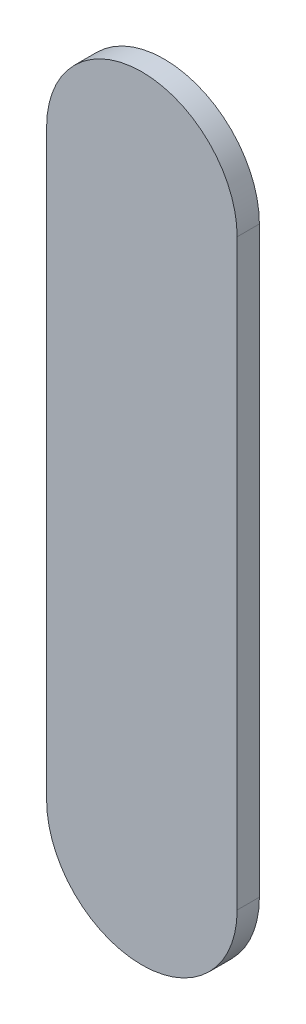
ISO-10303-21;
HEADER;
FILE_DESCRIPTION(('STEP AP214'),'2;1');
FILE_NAME('part.step','',(''),(''),'','','');
FILE_SCHEMA(('AUTOMOTIVE_DESIGN { 1 0 10303 214 1 1 1 1 }'));
ENDSEC;
DATA;
#1=APPLICATION_CONTEXT('core data for automotive mechanical design processes');
#2=APPLICATION_PROTOCOL_DEFINITION('international standard','automotive_design',2000,#1);
#3=PRODUCT_CONTEXT('',#1,'mechanical');
#4=PRODUCT('Part','Part','',(#3));
#5=PRODUCT_RELATED_PRODUCT_CATEGORY('part','',(#4));
#6=PRODUCT_DEFINITION_FORMATION('','',#4);
#7=PRODUCT_DEFINITION_CONTEXT('part definition',#1,'design');
#8=PRODUCT_DEFINITION('design','',#6,#7);
#9=PRODUCT_DEFINITION_SHAPE('','',#8);
#10=(LENGTH_UNIT() NAMED_UNIT(*) SI_UNIT(.MILLI.,.METRE.));
#11=(NAMED_UNIT(*) PLANE_ANGLE_UNIT() SI_UNIT($,.RADIAN.));
#12=(NAMED_UNIT(*) SI_UNIT($,.STERADIAN.) SOLID_ANGLE_UNIT());
#13=UNCERTAINTY_MEASURE_WITH_UNIT(LENGTH_MEASURE(1.E-05),#10,'distance_accuracy_value','');
#14=(GEOMETRIC_REPRESENTATION_CONTEXT(3) GLOBAL_UNCERTAINTY_ASSIGNED_CONTEXT((#13)) GLOBAL_UNIT_ASSIGNED_CONTEXT((#10,
#11,#12)) REPRESENTATION_CONTEXT('',''));
#15=CARTESIAN_POINT('',(0.,0.,0.));
#16=DIRECTION('',(0.,0.,1.));
#17=DIRECTION('',(1.,0.,0.));
#18=AXIS2_PLACEMENT_3D('',#15,#16,#17);
#19=CARTESIAN_POINT('',(150.95,-114.513,1.635));
#20=DIRECTION('',(0.,0.,1.));
#21=DIRECTION('',(1.,0.,0.));
#22=AXIS2_PLACEMENT_3D('',#19,#20,#21);
#23=PLANE('',#22);
#24=DIRECTION('',(0.,1.,0.));
#25=VECTOR('',#24,1.);
#26=CARTESIAN_POINT('',(150.95,-114.513,1.635));
#27=LINE('',#26,#25);
#28=CARTESIAN_POINT('',(150.95,-114.513,1.635));
#29=VERTEX_POINT('',#28);
#30=CARTESIAN_POINT('',(150.95,-113.595,1.635));
#31=VERTEX_POINT('',#30);
#32=EDGE_CURVE('E82',#29,#31,#27,.T.);
#33=ORIENTED_EDGE('',*,*,#32,.T.);
#34=CARTESIAN_POINT('',(150.8,-113.595,1.635));
#35=DIRECTION('',(0.,0.,1.));
#36=DIRECTION('',(1.,-1.894780628694E-13,0.));
#37=AXIS2_PLACEMENT_3D('',#34,#35,#36);
#38=CIRCLE('',#37,0.15);
#39=CARTESIAN_POINT('',(150.65,-113.595,1.635));
#40=VERTEX_POINT('',#39);
#41=EDGE_CURVE('E105',#31,#40,#38,.T.);
#42=ORIENTED_EDGE('',*,*,#41,.T.);
#43=DIRECTION('',(0.,-1.,0.));
#44=VECTOR('',#43,1.);
#45=CARTESIAN_POINT('',(150.65,-113.595,1.635));
#46=LINE('',#45,#44);
#47=CARTESIAN_POINT('',(150.65,-114.513,1.635));
#48=VERTEX_POINT('',#47);
#49=EDGE_CURVE('E75',#40,#48,#46,.T.);
#50=ORIENTED_EDGE('',*,*,#49,.T.);
#51=CARTESIAN_POINT('',(150.8,-114.513,1.635));
#52=DIRECTION('',(0.,0.,1.));
#53=DIRECTION('',(-1.,0.,0.));
#54=AXIS2_PLACEMENT_3D('',#51,#52,#53);
#55=CIRCLE('',#54,0.15);
#56=EDGE_CURVE('E11',#48,#29,#55,.T.);
#57=ORIENTED_EDGE('',*,*,#56,.T.);
#58=EDGE_LOOP('',(#33,#42,#50,#57));
#59=FACE_BOUND('',#58,.T.);
#60=ADVANCED_FACE('F17',(#59),#23,.T.);
#61=CARTESIAN_POINT('',(150.95,-114.513,1.6));
#62=DIRECTION('',(0.,0.,1.));
#63=DIRECTION('',(1.,0.,0.));
#64=AXIS2_PLACEMENT_3D('',#61,#62,#63);
#65=PLANE('',#64);
#66=CARTESIAN_POINT('',(150.8,-114.513,1.6));
#67=DIRECTION('',(0.,0.,1.));
#68=DIRECTION('',(-1.,0.,0.));
#69=AXIS2_PLACEMENT_3D('',#66,#67,#68);
#70=CIRCLE('',#69,0.15);
#71=CARTESIAN_POINT('',(150.65,-114.513,1.6));
#72=VERTEX_POINT('',#71);
#73=CARTESIAN_POINT('',(150.95,-114.513,1.6));
#74=VERTEX_POINT('',#73);
#75=EDGE_CURVE('E21',#72,#74,#70,.T.);
#76=ORIENTED_EDGE('',*,*,#75,.F.);
#77=DIRECTION('',(0.,-1.,0.));
#78=VECTOR('',#77,1.);
#79=CARTESIAN_POINT('',(150.65,-113.595,1.6));
#80=LINE('',#79,#78);
#81=CARTESIAN_POINT('',(150.65,-113.595,1.6));
#82=VERTEX_POINT('',#81);
#83=EDGE_CURVE('E109',#82,#72,#80,.T.);
#84=ORIENTED_EDGE('',*,*,#83,.F.);
#85=CARTESIAN_POINT('',(150.8,-113.595,1.6));
#86=DIRECTION('',(0.,0.,1.));
#87=DIRECTION('',(1.,-1.894780628694E-13,0.));
#88=AXIS2_PLACEMENT_3D('',#85,#86,#87);
#89=CIRCLE('',#88,0.15);
#90=CARTESIAN_POINT('',(150.95,-113.595,1.6));
#91=VERTEX_POINT('',#90);
#92=EDGE_CURVE('E84',#91,#82,#89,.T.);
#93=ORIENTED_EDGE('',*,*,#92,.F.);
#94=DIRECTION('',(0.,1.,0.));
#95=VECTOR('',#94,1.);
#96=CARTESIAN_POINT('',(150.95,-114.513,1.6));
#97=LINE('',#96,#95);
#98=EDGE_CURVE('E80',#74,#91,#97,.T.);
#99=ORIENTED_EDGE('',*,*,#98,.F.);
#100=EDGE_LOOP('',(#76,#84,#93,#99));
#101=FACE_BOUND('',#100,.T.);
#102=ADVANCED_FACE('F86',(#101),#65,.F.);
#103=CARTESIAN_POINT('',(150.8,-114.513,1.6));
#104=DIRECTION('',(0.,0.,-1.));
#105=DIRECTION('',(-1.,0.,0.));
#106=AXIS2_PLACEMENT_3D('',#103,#104,#105);
#107=CYLINDRICAL_SURFACE('',#106,0.15);
#108=ORIENTED_EDGE('',*,*,#75,.T.);
#109=DIRECTION('',(0.,0.,1.));
#110=VECTOR('',#109,1.);
#111=CARTESIAN_POINT('',(150.95,-114.513,1.6));
#112=LINE('',#111,#110);
#113=EDGE_CURVE('E69',#74,#29,#112,.T.);
#114=ORIENTED_EDGE('',*,*,#113,.T.);
#115=ORIENTED_EDGE('',*,*,#56,.F.);
#116=DIRECTION('',(0.,0.,1.));
#117=VECTOR('',#116,1.);
#118=CARTESIAN_POINT('',(150.65,-114.513,1.6));
#119=LINE('',#118,#117);
#120=EDGE_CURVE('E72',#72,#48,#119,.T.);
#121=ORIENTED_EDGE('',*,*,#120,.F.);
#122=EDGE_LOOP('',(#108,#114,#115,#121));
#123=FACE_BOUND('',#122,.T.);
#124=ADVANCED_FACE('F19',(#123),#107,.T.);
#125=CARTESIAN_POINT('',(150.65,-113.595,1.6));
#126=DIRECTION('',(1.,0.,0.));
#127=DIRECTION('',(0.,1.,0.));
#128=AXIS2_PLACEMENT_3D('',#125,#126,#127);
#129=PLANE('',#128);
#130=ORIENTED_EDGE('',*,*,#83,.T.);
#131=ORIENTED_EDGE('',*,*,#120,.T.);
#132=ORIENTED_EDGE('',*,*,#49,.F.);
#133=DIRECTION('',(0.,0.,1.));
#134=VECTOR('',#133,1.);
#135=CARTESIAN_POINT('',(150.65,-113.595,1.6));
#136=LINE('',#135,#134);
#137=EDGE_CURVE('E101',#82,#40,#136,.T.);
#138=ORIENTED_EDGE('',*,*,#137,.F.);
#139=EDGE_LOOP('',(#130,#131,#132,#138));
#140=FACE_BOUND('',#139,.T.);
#141=ADVANCED_FACE('F119',(#140),#129,.F.);
#142=CARTESIAN_POINT('',(150.8,-113.595,1.6));
#143=DIRECTION('',(0.,0.,-1.));
#144=DIRECTION('',(1.,-1.894780628694E-13,0.));
#145=AXIS2_PLACEMENT_3D('',#142,#143,#144);
#146=CYLINDRICAL_SURFACE('',#145,0.15);
#147=ORIENTED_EDGE('',*,*,#92,.T.);
#148=ORIENTED_EDGE('',*,*,#137,.T.);
#149=ORIENTED_EDGE('',*,*,#41,.F.);
#150=DIRECTION('',(0.,0.,1.));
#151=VECTOR('',#150,1.);
#152=CARTESIAN_POINT('',(150.95,-113.595,1.6));
#153=LINE('',#152,#151);
#154=EDGE_CURVE('E90',#91,#31,#153,.T.);
#155=ORIENTED_EDGE('',*,*,#154,.F.);
#156=EDGE_LOOP('',(#147,#148,#149,#155));
#157=FACE_BOUND('',#156,.T.);
#158=ADVANCED_FACE('F121',(#157),#146,.T.);
#159=CARTESIAN_POINT('',(150.95,-114.513,1.6));
#160=DIRECTION('',(-1.,0.,0.));
#161=DIRECTION('',(0.,0.,1.));
#162=AXIS2_PLACEMENT_3D('',#159,#160,#161);
#163=PLANE('',#162);
#164=ORIENTED_EDGE('',*,*,#98,.T.);
#165=ORIENTED_EDGE('',*,*,#154,.T.);
#166=ORIENTED_EDGE('',*,*,#32,.F.);
#167=ORIENTED_EDGE('',*,*,#113,.F.);
#168=EDGE_LOOP('',(#164,#165,#166,#167));
#169=FACE_BOUND('',#168,.T.);
#170=ADVANCED_FACE('F78',(#169),#163,.F.);
#171=CLOSED_SHELL('',(#60,#102,#124,#141,#158,#170));
#172=MANIFOLD_SOLID_BREP('B1',#171);
#173=ADVANCED_BREP_SHAPE_REPRESENTATION('',(#18,#172),#14);
#174=SHAPE_DEFINITION_REPRESENTATION(#9,#173);
ENDSEC;
END-ISO-10303-21;
